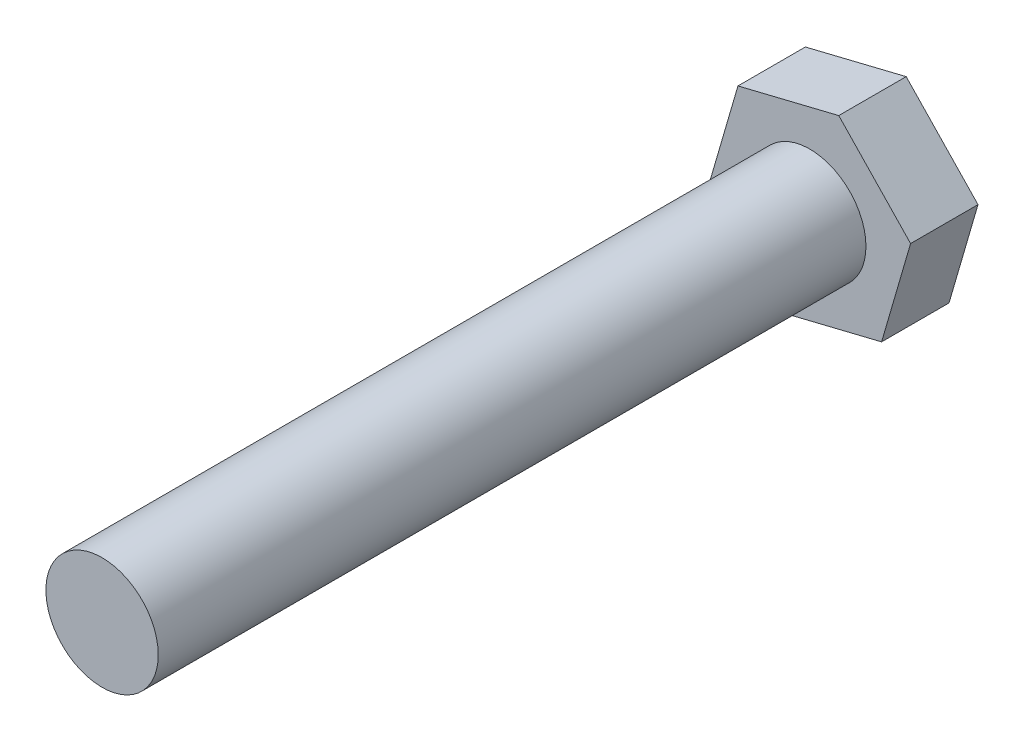
ISO-10303-21;
HEADER;
FILE_DESCRIPTION(('STEP AP214'),'2;1');
FILE_NAME('part.step','',(''),(''),'','','');
FILE_SCHEMA(('AUTOMOTIVE_DESIGN { 1 0 10303 214 1 1 1 1 }'));
ENDSEC;
DATA;
#1=APPLICATION_CONTEXT('core data for automotive mechanical design processes');
#2=APPLICATION_PROTOCOL_DEFINITION('international standard','automotive_design',2000,#1);
#3=PRODUCT_CONTEXT('',#1,'mechanical');
#4=PRODUCT('Part','Part','',(#3));
#5=PRODUCT_RELATED_PRODUCT_CATEGORY('part','',(#4));
#6=PRODUCT_DEFINITION_FORMATION('','',#4);
#7=PRODUCT_DEFINITION_CONTEXT('part definition',#1,'design');
#8=PRODUCT_DEFINITION('design','',#6,#7);
#9=PRODUCT_DEFINITION_SHAPE('','',#8);
#10=(LENGTH_UNIT() NAMED_UNIT(*) SI_UNIT(.MILLI.,.METRE.));
#11=(NAMED_UNIT(*) PLANE_ANGLE_UNIT() SI_UNIT($,.RADIAN.));
#12=(NAMED_UNIT(*) SI_UNIT($,.STERADIAN.) SOLID_ANGLE_UNIT());
#13=UNCERTAINTY_MEASURE_WITH_UNIT(LENGTH_MEASURE(1.E-05),#10,'distance_accuracy_value','');
#14=(GEOMETRIC_REPRESENTATION_CONTEXT(3) GLOBAL_UNCERTAINTY_ASSIGNED_CONTEXT((#13)) GLOBAL_UNIT_ASSIGNED_CONTEXT((#10,
#11,#12)) REPRESENTATION_CONTEXT('',''));
#15=CARTESIAN_POINT('',(0.,0.,0.));
#16=DIRECTION('',(0.,0.,1.));
#17=DIRECTION('',(1.,0.,0.));
#18=AXIS2_PLACEMENT_3D('',#15,#16,#17);
#19=CARTESIAN_POINT('',(1.29006582959035,4.43498179124297,3.));
#20=DIRECTION('',(0.238213519019037,-0.971212808480493,0.));
#21=DIRECTION('',(0.971212808480493,0.238213519019037,0.));
#22=AXIS2_PLACEMENT_3D('',#19,#20,#21);
#23=PLANE('',#22);
#24=DIRECTION('',(-0.971212808480493,-0.238213519019037,0.));
#25=VECTOR('',#24,1.);
#26=CARTESIAN_POINT('',(1.29006582959035,4.43498179124297,0.));
#27=LINE('',#26,#25);
#28=CARTESIAN_POINT('',(1.29006582959035,4.43498179124297,0.));
#29=VERTEX_POINT('',#28);
#30=CARTESIAN_POINT('',(-3.19577398174265,3.33472067660098,0.));
#31=VERTEX_POINT('',#30);
#32=EDGE_CURVE('E119',#29,#31,#27,.T.);
#33=ORIENTED_EDGE('',*,*,#32,.T.);
#34=DIRECTION('',(0.,0.,-1.));
#35=VECTOR('',#34,1.);
#36=CARTESIAN_POINT('',(-3.19577398174265,3.33472067660098,3.));
#37=LINE('',#36,#35);
#38=CARTESIAN_POINT('',(-3.19577398174265,3.33472067660098,3.));
#39=VERTEX_POINT('',#38);
#40=EDGE_CURVE('E36',#39,#31,#37,.T.);
#41=ORIENTED_EDGE('',*,*,#40,.F.);
#42=DIRECTION('',(-0.971212808480493,-0.238213519019037,0.));
#43=VECTOR('',#42,1.);
#44=CARTESIAN_POINT('',(1.29006582959035,4.43498179124297,3.));
#45=LINE('',#44,#43);
#46=CARTESIAN_POINT('',(1.29006582959035,4.43498179124297,3.));
#47=VERTEX_POINT('',#46);
#48=EDGE_CURVE('E130',#47,#39,#45,.T.);
#49=ORIENTED_EDGE('',*,*,#48,.F.);
#50=DIRECTION('',(0.,0.,-1.));
#51=VECTOR('',#50,1.);
#52=CARTESIAN_POINT('',(1.29006582959035,4.43498179124297,3.));
#53=LINE('',#52,#51);
#54=EDGE_CURVE('E115',#47,#29,#53,.T.);
#55=ORIENTED_EDGE('',*,*,#54,.T.);
#56=EDGE_LOOP('',(#33,#41,#49,#55));
#57=FACE_BOUND('',#56,.T.);
#58=ADVANCED_FACE('F33',(#57),#23,.F.);
#59=CARTESIAN_POINT('',(-3.19577398174265,3.33472067660098,3.));
#60=DIRECTION('',(0.960201724134456,-0.279307445244873,0.));
#61=DIRECTION('',(0.279307445244873,0.960201724134456,0.));
#62=AXIS2_PLACEMENT_3D('',#59,#60,#61);
#63=PLANE('',#62);
#64=DIRECTION('',(-0.279307445244873,-0.960201724134456,0.));
#65=VECTOR('',#64,1.);
#66=CARTESIAN_POINT('',(-3.19577398174265,3.33472067660098,0.));
#67=LINE('',#66,#65);
#68=CARTESIAN_POINT('',(-4.485839811333,-1.100261114642,0.));
#69=VERTEX_POINT('',#68);
#70=EDGE_CURVE('E122',#31,#69,#67,.T.);
#71=ORIENTED_EDGE('',*,*,#70,.T.);
#72=DIRECTION('',(0.,0.,-1.));
#73=VECTOR('',#72,1.);
#74=CARTESIAN_POINT('',(-4.485839811333,-1.100261114642,3.));
#75=LINE('',#74,#73);
#76=CARTESIAN_POINT('',(-4.485839811333,-1.100261114642,3.));
#77=VERTEX_POINT('',#76);
#78=EDGE_CURVE('E133',#77,#69,#75,.T.);
#79=ORIENTED_EDGE('',*,*,#78,.F.);
#80=DIRECTION('',(-0.279307445244873,-0.960201724134456,0.));
#81=VECTOR('',#80,1.);
#82=CARTESIAN_POINT('',(-3.19577398174265,3.33472067660098,3.));
#83=LINE('',#82,#81);
#84=EDGE_CURVE('E88',#39,#77,#83,.T.);
#85=ORIENTED_EDGE('',*,*,#84,.F.);
#86=ORIENTED_EDGE('',*,*,#40,.T.);
#87=EDGE_LOOP('',(#71,#79,#85,#86));
#88=FACE_BOUND('',#87,.T.);
#89=ADVANCED_FACE('F138',(#88),#63,.F.);
#90=CARTESIAN_POINT('',(-4.485839811333,-1.100261114642,3.));
#91=DIRECTION('',(0.721988205115419,0.69190536323562,0.));
#92=DIRECTION('',(-0.691905363235621,0.721988205115419,0.));
#93=AXIS2_PLACEMENT_3D('',#90,#91,#92);
#94=PLANE('',#93);
#95=DIRECTION('',(0.691905363235621,-0.721988205115419,0.));
#96=VECTOR('',#95,1.);
#97=CARTESIAN_POINT('',(-4.485839811333,-1.100261114642,0.));
#98=LINE('',#97,#96);
#99=CARTESIAN_POINT('',(-1.29006582959035,-4.43498179124297,0.));
#100=VERTEX_POINT('',#99);
#101=EDGE_CURVE('E125',#69,#100,#98,.T.);
#102=ORIENTED_EDGE('',*,*,#101,.T.);
#103=DIRECTION('',(0.,0.,-1.));
#104=VECTOR('',#103,1.);
#105=CARTESIAN_POINT('',(-1.29006582959035,-4.43498179124297,3.));
#106=LINE('',#105,#104);
#107=CARTESIAN_POINT('',(-1.29006582959035,-4.43498179124297,3.));
#108=VERTEX_POINT('',#107);
#109=EDGE_CURVE('E110',#108,#100,#106,.T.);
#110=ORIENTED_EDGE('',*,*,#109,.F.);
#111=DIRECTION('',(0.691905363235621,-0.721988205115419,0.));
#112=VECTOR('',#111,1.);
#113=CARTESIAN_POINT('',(-4.485839811333,-1.100261114642,3.));
#114=LINE('',#113,#112);
#115=EDGE_CURVE('E101',#77,#108,#114,.T.);
#116=ORIENTED_EDGE('',*,*,#115,.F.);
#117=ORIENTED_EDGE('',*,*,#78,.T.);
#118=EDGE_LOOP('',(#102,#110,#116,#117));
#119=FACE_BOUND('',#118,.T.);
#120=ADVANCED_FACE('F144',(#119),#94,.F.);
#121=CARTESIAN_POINT('',(-1.29006582959035,-4.43498179124297,3.));
#122=DIRECTION('',(-0.238213519019037,0.971212808480493,0.));
#123=DIRECTION('',(-0.971212808480493,-0.238213519019037,0.));
#124=AXIS2_PLACEMENT_3D('',#121,#122,#123);
#125=PLANE('',#124);
#126=DIRECTION('',(0.971212808480493,0.238213519019037,0.));
#127=VECTOR('',#126,1.);
#128=CARTESIAN_POINT('',(-1.29006582959035,-4.43498179124297,0.));
#129=LINE('',#128,#127);
#130=CARTESIAN_POINT('',(3.19577398174265,-3.33472067660098,0.));
#131=VERTEX_POINT('',#130);
#132=EDGE_CURVE('E109',#100,#131,#129,.T.);
#133=ORIENTED_EDGE('',*,*,#132,.T.);
#134=DIRECTION('',(0.,0.,-1.));
#135=VECTOR('',#134,1.);
#136=CARTESIAN_POINT('',(3.19577398174265,-3.33472067660098,3.));
#137=LINE('',#136,#135);
#138=CARTESIAN_POINT('',(3.19577398174265,-3.33472067660098,3.));
#139=VERTEX_POINT('',#138);
#140=EDGE_CURVE('E106',#139,#131,#137,.T.);
#141=ORIENTED_EDGE('',*,*,#140,.F.);
#142=DIRECTION('',(0.971212808480493,0.238213519019037,0.));
#143=VECTOR('',#142,1.);
#144=CARTESIAN_POINT('',(-1.29006582959035,-4.43498179124297,3.));
#145=LINE('',#144,#143);
#146=EDGE_CURVE('E95',#108,#139,#145,.T.);
#147=ORIENTED_EDGE('',*,*,#146,.F.);
#148=ORIENTED_EDGE('',*,*,#109,.T.);
#149=EDGE_LOOP('',(#133,#141,#147,#148));
#150=FACE_BOUND('',#149,.T.);
#151=ADVANCED_FACE('F107',(#150),#125,.F.);
#152=CARTESIAN_POINT('',(3.19577398174265,-3.33472067660098,3.));
#153=DIRECTION('',(-0.960201724134456,0.279307445244872,0.));
#154=DIRECTION('',(-0.279307445244873,-0.960201724134456,0.));
#155=AXIS2_PLACEMENT_3D('',#152,#153,#154);
#156=PLANE('',#155);
#157=DIRECTION('',(0.279307445244872,0.960201724134456,0.));
#158=VECTOR('',#157,1.);
#159=CARTESIAN_POINT('',(3.19577398174265,-3.33472067660098,0.));
#160=LINE('',#159,#158);
#161=CARTESIAN_POINT('',(4.485839811333,1.10026111464199,0.));
#162=VERTEX_POINT('',#161);
#163=EDGE_CURVE('E73',#131,#162,#160,.T.);
#164=ORIENTED_EDGE('',*,*,#163,.T.);
#165=DIRECTION('',(0.,0.,-1.));
#166=VECTOR('',#165,1.);
#167=CARTESIAN_POINT('',(4.485839811333,1.10026111464199,3.));
#168=LINE('',#167,#166);
#169=CARTESIAN_POINT('',(4.485839811333,1.10026111464199,3.));
#170=VERTEX_POINT('',#169);
#171=EDGE_CURVE('E111',#170,#162,#168,.T.);
#172=ORIENTED_EDGE('',*,*,#171,.F.);
#173=DIRECTION('',(0.279307445244872,0.960201724134456,0.));
#174=VECTOR('',#173,1.);
#175=CARTESIAN_POINT('',(3.19577398174265,-3.33472067660098,3.));
#176=LINE('',#175,#174);
#177=EDGE_CURVE('E99',#139,#170,#176,.T.);
#178=ORIENTED_EDGE('',*,*,#177,.F.);
#179=ORIENTED_EDGE('',*,*,#140,.T.);
#180=EDGE_LOOP('',(#164,#172,#178,#179));
#181=FACE_BOUND('',#180,.T.);
#182=ADVANCED_FACE('F113',(#181),#156,.F.);
#183=CARTESIAN_POINT('',(4.485839811333,1.10026111464199,3.));
#184=DIRECTION('',(-0.721988205115419,-0.69190536323562,0.));
#185=DIRECTION('',(0.69190536323562,-0.721988205115419,0.));
#186=AXIS2_PLACEMENT_3D('',#183,#184,#185);
#187=PLANE('',#186);
#188=DIRECTION('',(-0.69190536323562,0.721988205115419,0.));
#189=VECTOR('',#188,1.);
#190=CARTESIAN_POINT('',(4.485839811333,1.10026111464199,0.));
#191=LINE('',#190,#189);
#192=EDGE_CURVE('E79',#162,#29,#191,.T.);
#193=ORIENTED_EDGE('',*,*,#192,.T.);
#194=ORIENTED_EDGE('',*,*,#54,.F.);
#195=DIRECTION('',(-0.69190536323562,0.721988205115419,0.));
#196=VECTOR('',#195,1.);
#197=CARTESIAN_POINT('',(4.485839811333,1.10026111464199,3.));
#198=LINE('',#197,#196);
#199=EDGE_CURVE('E50',#170,#47,#198,.T.);
#200=ORIENTED_EDGE('',*,*,#199,.F.);
#201=ORIENTED_EDGE('',*,*,#171,.T.);
#202=EDGE_LOOP('',(#193,#194,#200,#201));
#203=FACE_BOUND('',#202,.T.);
#204=ADVANCED_FACE('F160',(#203),#187,.F.);
#205=CARTESIAN_POINT('',(0.,0.,3.));
#206=DIRECTION('',(0.,0.,1.));
#207=DIRECTION('',(1.,0.,0.));
#208=AXIS2_PLACEMENT_3D('',#205,#206,#207);
#209=PLANE('',#208);
#210=CARTESIAN_POINT('',(0.,0.,3.));
#211=DIRECTION('',(0.,0.,1.));
#212=DIRECTION('',(1.,0.,0.));
#213=AXIS2_PLACEMENT_3D('',#210,#211,#212);
#214=CIRCLE('',#213,2.5);
#215=CARTESIAN_POINT('',(2.5,0.,3.));
#216=VERTEX_POINT('',#215);
#217=EDGE_CURVE('E11',#216,#216,#214,.T.);
#218=ORIENTED_EDGE('',*,*,#217,.F.);
#219=EDGE_LOOP('',(#218));
#220=FACE_BOUND('',#219,.T.);
#221=ORIENTED_EDGE('',*,*,#48,.T.);
#222=ORIENTED_EDGE('',*,*,#84,.T.);
#223=ORIENTED_EDGE('',*,*,#115,.T.);
#224=ORIENTED_EDGE('',*,*,#146,.T.);
#225=ORIENTED_EDGE('',*,*,#177,.T.);
#226=ORIENTED_EDGE('',*,*,#199,.T.);
#227=EDGE_LOOP('',(#221,#222,#223,#224,#225,#226));
#228=FACE_BOUND('',#227,.T.);
#229=ADVANCED_FACE('F97',(#220,#228),#209,.T.);
#230=CARTESIAN_POINT('',(0.,0.,0.));
#231=DIRECTION('',(0.,0.,1.));
#232=DIRECTION('',(1.,0.,0.));
#233=AXIS2_PLACEMENT_3D('',#230,#231,#232);
#234=PLANE('',#233);
#235=ORIENTED_EDGE('',*,*,#32,.F.);
#236=ORIENTED_EDGE('',*,*,#192,.F.);
#237=ORIENTED_EDGE('',*,*,#163,.F.);
#238=ORIENTED_EDGE('',*,*,#132,.F.);
#239=ORIENTED_EDGE('',*,*,#101,.F.);
#240=ORIENTED_EDGE('',*,*,#70,.F.);
#241=EDGE_LOOP('',(#235,#236,#237,#238,#239,#240));
#242=FACE_BOUND('',#241,.T.);
#243=ADVANCED_FACE('F143',(#242),#234,.F.);
#244=CARTESIAN_POINT('',(0.,0.,34.492));
#245=DIRECTION('',(0.,0.,-1.));
#246=DIRECTION('',(-1.,0.,0.));
#247=AXIS2_PLACEMENT_3D('',#244,#245,#246);
#248=CYLINDRICAL_SURFACE('',#247,2.5);
#249=CARTESIAN_POINT('',(0.,0.,34.492));
#250=DIRECTION('',(0.,0.,1.));
#251=DIRECTION('',(1.,0.,0.));
#252=AXIS2_PLACEMENT_3D('',#249,#250,#251);
#253=CIRCLE('',#252,2.5);
#254=CARTESIAN_POINT('',(2.5,0.,34.492));
#255=VERTEX_POINT('',#254);
#256=EDGE_CURVE('E123',#255,#255,#253,.T.);
#257=ORIENTED_EDGE('',*,*,#256,.F.);
#258=EDGE_LOOP('',(#257));
#259=FACE_BOUND('',#258,.T.);
#260=ORIENTED_EDGE('',*,*,#217,.T.);
#261=EDGE_LOOP('',(#260));
#262=FACE_BOUND('',#261,.T.);
#263=ADVANCED_FACE('F153',(#259,#262),#248,.T.);
#264=CARTESIAN_POINT('',(0.,0.,34.492));
#265=DIRECTION('',(0.,0.,1.));
#266=DIRECTION('',(1.,0.,0.));
#267=AXIS2_PLACEMENT_3D('',#264,#265,#266);
#268=PLANE('',#267);
#269=ORIENTED_EDGE('',*,*,#256,.T.);
#270=EDGE_LOOP('',(#269));
#271=FACE_BOUND('',#270,.T.);
#272=ADVANCED_FACE('F151',(#271),#268,.T.);
#273=CLOSED_SHELL('',(#58,#89,#120,#151,#182,#204,#229,#243,#263,#272));
#274=MANIFOLD_SOLID_BREP('B2',#273);
#275=ADVANCED_BREP_SHAPE_REPRESENTATION('',(#18,#274),#14);
#276=SHAPE_DEFINITION_REPRESENTATION(#9,#275);
ENDSEC;
END-ISO-10303-21;
